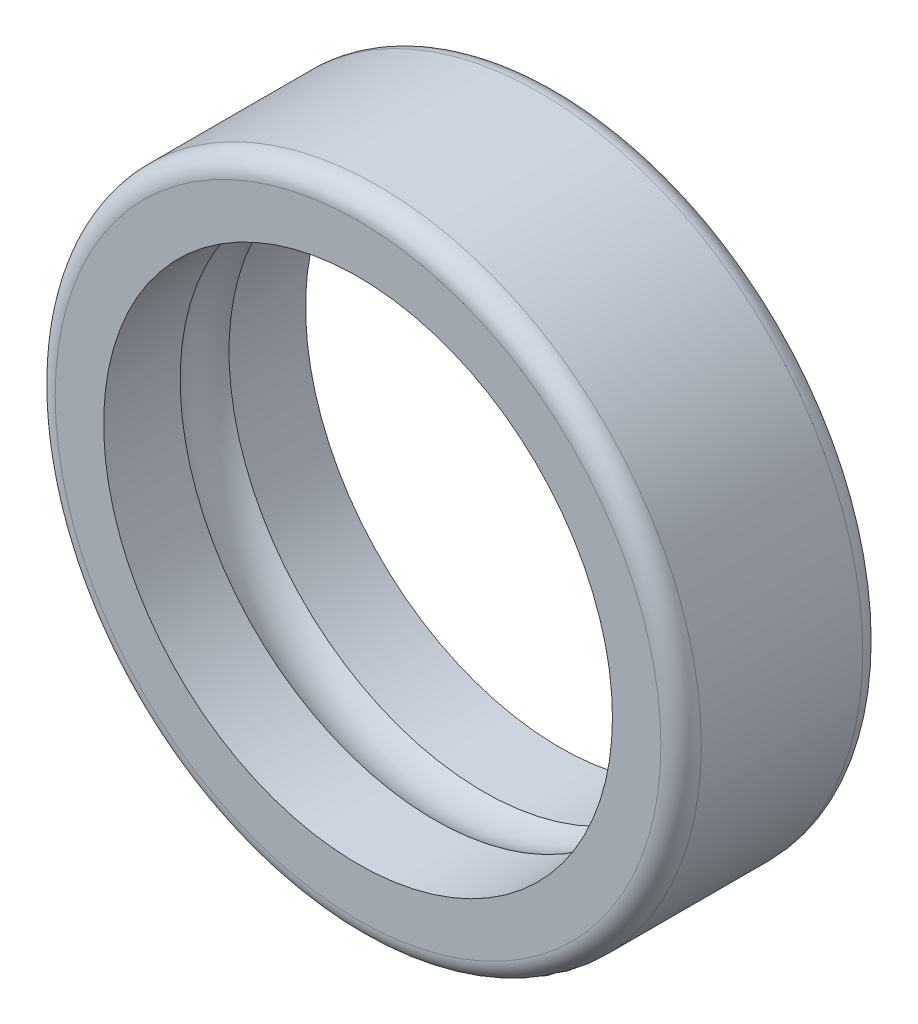
ISO-10303-21;
HEADER;
FILE_DESCRIPTION(('STEP AP214'),'2;1');
FILE_NAME('part.step','',(''),(''),'','','');
FILE_SCHEMA(('AUTOMOTIVE_DESIGN { 1 0 10303 214 1 1 1 1 }'));
ENDSEC;
DATA;
#1=APPLICATION_CONTEXT('core data for automotive mechanical design processes');
#2=APPLICATION_PROTOCOL_DEFINITION('international standard','automotive_design',2000,#1);
#3=PRODUCT_CONTEXT('',#1,'mechanical');
#4=PRODUCT('Part','Part','',(#3));
#5=PRODUCT_RELATED_PRODUCT_CATEGORY('part','',(#4));
#6=PRODUCT_DEFINITION_FORMATION('','',#4);
#7=PRODUCT_DEFINITION_CONTEXT('part definition',#1,'design');
#8=PRODUCT_DEFINITION('design','',#6,#7);
#9=PRODUCT_DEFINITION_SHAPE('','',#8);
#10=(LENGTH_UNIT() NAMED_UNIT(*) SI_UNIT(.MILLI.,.METRE.));
#11=(NAMED_UNIT(*) PLANE_ANGLE_UNIT() SI_UNIT($,.RADIAN.));
#12=(NAMED_UNIT(*) SI_UNIT($,.STERADIAN.) SOLID_ANGLE_UNIT());
#13=UNCERTAINTY_MEASURE_WITH_UNIT(LENGTH_MEASURE(1.E-05),#10,'distance_accuracy_value','');
#14=(GEOMETRIC_REPRESENTATION_CONTEXT(3) GLOBAL_UNCERTAINTY_ASSIGNED_CONTEXT((#13)) GLOBAL_UNIT_ASSIGNED_CONTEXT((#10,
#11,#12)) REPRESENTATION_CONTEXT('',''));
#15=CARTESIAN_POINT('',(0.,0.,0.));
#16=DIRECTION('',(0.,0.,1.));
#17=DIRECTION('',(1.,0.,0.));
#18=AXIS2_PLACEMENT_3D('',#15,#16,#17);
#19=CARTESIAN_POINT('',(0.,0.,0.));
#20=DIRECTION('',(0.,0.,1.));
#21=DIRECTION('',(1.,0.,0.));
#22=AXIS2_PLACEMENT_3D('',#19,#20,#21);
#23=TOROIDAL_SURFACE('',#22,5.25,1.21175743903915);
#24=CARTESIAN_POINT('',(0.,0.,0.604860389731972));
#25=DIRECTION('',(0.,0.,1.));
#26=DIRECTION('',(1.,0.,0.));
#27=AXIS2_PLACEMENT_3D('',#24,#25,#26);
#28=CIRCLE('',#27,6.3);
#29=CARTESIAN_POINT('',(6.3,0.,0.604860389731972));
#30=VERTEX_POINT('',#29);
#31=EDGE_CURVE('E110',#30,#30,#28,.T.);
#32=ORIENTED_EDGE('',*,*,#31,.T.);
#33=EDGE_LOOP('',(#32));
#34=FACE_BOUND('',#33,.T.);
#35=CARTESIAN_POINT('',(0.,0.,-0.604860389731972));
#36=DIRECTION('',(0.,0.,1.));
#37=DIRECTION('',(1.,0.,0.));
#38=AXIS2_PLACEMENT_3D('',#35,#36,#37);
#39=CIRCLE('',#38,6.3);
#40=CARTESIAN_POINT('',(6.3,0.,-0.604860389731972));
#41=VERTEX_POINT('',#40);
#42=EDGE_CURVE('E107',#41,#41,#39,.F.);
#43=ORIENTED_EDGE('',*,*,#42,.T.);
#44=EDGE_LOOP('',(#43));
#45=FACE_BOUND('',#44,.T.);
#46=ADVANCED_FACE('F15',(#34,#45),#23,.F.);
#47=CARTESIAN_POINT('',(0.,0.,2.5));
#48=DIRECTION('',(0.,0.,1.));
#49=DIRECTION('',(1.,0.,0.));
#50=AXIS2_PLACEMENT_3D('',#47,#48,#49);
#51=CYLINDRICAL_SURFACE('',#50,6.3);
#52=CARTESIAN_POINT('',(0.,0.,2.5));
#53=DIRECTION('',(0.,0.,1.));
#54=DIRECTION('',(1.,0.,0.));
#55=AXIS2_PLACEMENT_3D('',#52,#53,#54);
#56=CIRCLE('',#55,6.3);
#57=CARTESIAN_POINT('',(6.3,0.,2.5));
#58=VERTEX_POINT('',#57);
#59=EDGE_CURVE('E19',#58,#58,#56,.T.);
#60=ORIENTED_EDGE('',*,*,#59,.T.);
#61=EDGE_LOOP('',(#60));
#62=FACE_BOUND('',#61,.T.);
#63=ORIENTED_EDGE('',*,*,#31,.F.);
#64=EDGE_LOOP('',(#63));
#65=FACE_BOUND('',#64,.T.);
#66=ADVANCED_FACE('F82',(#62,#65),#51,.F.);
#67=CARTESIAN_POINT('',(0.,0.,2.5));
#68=DIRECTION('',(0.,0.,1.));
#69=DIRECTION('',(1.,0.,0.));
#70=AXIS2_PLACEMENT_3D('',#67,#68,#69);
#71=CYLINDRICAL_SURFACE('',#70,6.3);
#72=ORIENTED_EDGE('',*,*,#42,.F.);
#73=EDGE_LOOP('',(#72));
#74=FACE_BOUND('',#73,.T.);
#75=CARTESIAN_POINT('',(0.,0.,-2.5));
#76=DIRECTION('',(0.,0.,1.));
#77=DIRECTION('',(1.,0.,0.));
#78=AXIS2_PLACEMENT_3D('',#75,#76,#77);
#79=CIRCLE('',#78,6.3);
#80=CARTESIAN_POINT('',(6.3,0.,-2.5));
#81=VERTEX_POINT('',#80);
#82=EDGE_CURVE('E103',#81,#81,#79,.F.);
#83=ORIENTED_EDGE('',*,*,#82,.T.);
#84=EDGE_LOOP('',(#83));
#85=FACE_BOUND('',#84,.T.);
#86=ADVANCED_FACE('F78',(#74,#85),#71,.F.);
#87=CARTESIAN_POINT('',(0.,7.75,2.5));
#88=DIRECTION('',(0.,0.,-1.));
#89=DIRECTION('',(-1.,0.,0.));
#90=AXIS2_PLACEMENT_3D('',#87,#88,#89);
#91=PLANE('',#90);
#92=ORIENTED_EDGE('',*,*,#59,.F.);
#93=EDGE_LOOP('',(#92));
#94=FACE_BOUND('',#93,.T.);
#95=CARTESIAN_POINT('',(0.,0.,2.5));
#96=DIRECTION('',(0.,0.,-1.));
#97=DIRECTION('',(-1.,0.,0.));
#98=AXIS2_PLACEMENT_3D('',#95,#96,#97);
#99=CIRCLE('',#98,7.5);
#100=CARTESIAN_POINT('',(-7.5,0.,2.5));
#101=VERTEX_POINT('',#100);
#102=EDGE_CURVE('E62',#101,#101,#99,.T.);
#103=ORIENTED_EDGE('',*,*,#102,.F.);
#104=EDGE_LOOP('',(#103));
#105=FACE_BOUND('',#104,.T.);
#106=ADVANCED_FACE('F68',(#94,#105),#91,.F.);
#107=CARTESIAN_POINT('',(0.,7.75,-2.5));
#108=DIRECTION('',(0.,0.,1.));
#109=DIRECTION('',(1.,0.,0.));
#110=AXIS2_PLACEMENT_3D('',#107,#108,#109);
#111=PLANE('',#110);
#112=ORIENTED_EDGE('',*,*,#82,.F.);
#113=EDGE_LOOP('',(#112));
#114=FACE_BOUND('',#113,.T.);
#115=CARTESIAN_POINT('',(0.,0.,-2.5));
#116=DIRECTION('',(0.,0.,1.));
#117=DIRECTION('',(1.,0.,0.));
#118=AXIS2_PLACEMENT_3D('',#115,#116,#117);
#119=CIRCLE('',#118,7.5);
#120=CARTESIAN_POINT('',(7.5,0.,-2.5));
#121=VERTEX_POINT('',#120);
#122=EDGE_CURVE('E28',#121,#121,#119,.T.);
#123=ORIENTED_EDGE('',*,*,#122,.F.);
#124=EDGE_LOOP('',(#123));
#125=FACE_BOUND('',#124,.T.);
#126=ADVANCED_FACE('F77',(#114,#125),#111,.F.);
#127=CARTESIAN_POINT('',(0.,0.,2.));
#128=DIRECTION('',(0.,0.,1.));
#129=DIRECTION('',(1.,0.,0.));
#130=AXIS2_PLACEMENT_3D('',#127,#128,#129);
#131=TOROIDAL_SURFACE('',#130,7.5,0.5);
#132=CARTESIAN_POINT('',(0.,0.,2.));
#133=DIRECTION('',(0.,0.,1.));
#134=DIRECTION('',(1.,0.,0.));
#135=AXIS2_PLACEMENT_3D('',#132,#133,#134);
#136=CIRCLE('',#135,8.);
#137=CARTESIAN_POINT('',(8.,0.,2.));
#138=VERTEX_POINT('',#137);
#139=EDGE_CURVE('E23',#138,#138,#136,.F.);
#140=ORIENTED_EDGE('',*,*,#139,.F.);
#141=EDGE_LOOP('',(#140));
#142=FACE_BOUND('',#141,.T.);
#143=ORIENTED_EDGE('',*,*,#102,.T.);
#144=EDGE_LOOP('',(#143));
#145=FACE_BOUND('',#144,.T.);
#146=ADVANCED_FACE('F42',(#142,#145),#131,.T.);
#147=CARTESIAN_POINT('',(0.,0.,-2.));
#148=DIRECTION('',(0.,0.,-1.));
#149=DIRECTION('',(-1.,0.,0.));
#150=AXIS2_PLACEMENT_3D('',#147,#148,#149);
#151=TOROIDAL_SURFACE('',#150,7.5,0.5);
#152=CARTESIAN_POINT('',(0.,0.,-2.));
#153=DIRECTION('',(0.,0.,1.));
#154=DIRECTION('',(1.,0.,0.));
#155=AXIS2_PLACEMENT_3D('',#152,#153,#154);
#156=CIRCLE('',#155,8.);
#157=CARTESIAN_POINT('',(8.,0.,-2.));
#158=VERTEX_POINT('',#157);
#159=EDGE_CURVE('E10',#158,#158,#156,.T.);
#160=ORIENTED_EDGE('',*,*,#159,.F.);
#161=EDGE_LOOP('',(#160));
#162=FACE_BOUND('',#161,.T.);
#163=ORIENTED_EDGE('',*,*,#122,.T.);
#164=EDGE_LOOP('',(#163));
#165=FACE_BOUND('',#164,.T.);
#166=ADVANCED_FACE('F36',(#162,#165),#151,.T.);
#167=CARTESIAN_POINT('',(0.,0.,2.5));
#168=DIRECTION('',(0.,0.,1.));
#169=DIRECTION('',(1.,0.,0.));
#170=AXIS2_PLACEMENT_3D('',#167,#168,#169);
#171=CYLINDRICAL_SURFACE('',#170,8.);
#172=ORIENTED_EDGE('',*,*,#159,.T.);
#173=EDGE_LOOP('',(#172));
#174=FACE_BOUND('',#173,.T.);
#175=ORIENTED_EDGE('',*,*,#139,.T.);
#176=EDGE_LOOP('',(#175));
#177=FACE_BOUND('',#176,.T.);
#178=ADVANCED_FACE('F41',(#174,#177),#171,.T.);
#179=CLOSED_SHELL('',(#46,#66,#86,#106,#126,#146,#166,#178));
#180=MANIFOLD_SOLID_BREP('B1',#179);
#181=ADVANCED_BREP_SHAPE_REPRESENTATION('',(#18,#180),#14);
#182=SHAPE_DEFINITION_REPRESENTATION(#9,#181);
ENDSEC;
END-ISO-10303-21;
